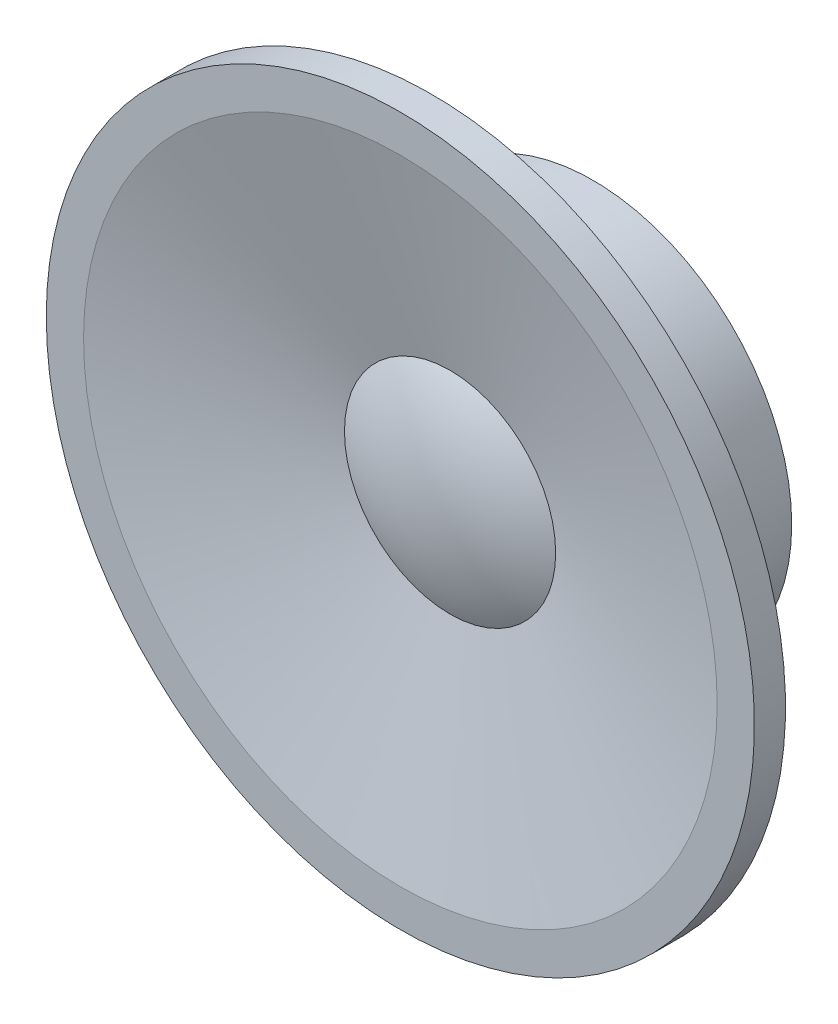
ISO-10303-21;
HEADER;
FILE_DESCRIPTION(('STEP AP214'),'2;1');
FILE_NAME('part.step','',(''),(''),'','','');
FILE_SCHEMA(('AUTOMOTIVE_DESIGN { 1 0 10303 214 1 1 1 1 }'));
ENDSEC;
DATA;
#1=APPLICATION_CONTEXT('core data for automotive mechanical design processes');
#2=APPLICATION_PROTOCOL_DEFINITION('international standard','automotive_design',2000,#1);
#3=PRODUCT_CONTEXT('',#1,'mechanical');
#4=PRODUCT('Part','Part','',(#3));
#5=PRODUCT_RELATED_PRODUCT_CATEGORY('part','',(#4));
#6=PRODUCT_DEFINITION_FORMATION('','',#4);
#7=PRODUCT_DEFINITION_CONTEXT('part definition',#1,'design');
#8=PRODUCT_DEFINITION('design','',#6,#7);
#9=PRODUCT_DEFINITION_SHAPE('','',#8);
#10=(LENGTH_UNIT() NAMED_UNIT(*) SI_UNIT(.MILLI.,.METRE.));
#11=(NAMED_UNIT(*) PLANE_ANGLE_UNIT() SI_UNIT($,.RADIAN.));
#12=(NAMED_UNIT(*) SI_UNIT($,.STERADIAN.) SOLID_ANGLE_UNIT());
#13=UNCERTAINTY_MEASURE_WITH_UNIT(LENGTH_MEASURE(1.E-05),#10,'distance_accuracy_value','');
#14=(GEOMETRIC_REPRESENTATION_CONTEXT(3) GLOBAL_UNCERTAINTY_ASSIGNED_CONTEXT((#13)) GLOBAL_UNIT_ASSIGNED_CONTEXT((#10,
#11,#12)) REPRESENTATION_CONTEXT('',''));
#15=CARTESIAN_POINT('',(0.,0.,0.));
#16=DIRECTION('',(0.,0.,1.));
#17=DIRECTION('',(1.,0.,0.));
#18=AXIS2_PLACEMENT_3D('',#15,#16,#17);
#19=CARTESIAN_POINT('',(0.,0.,-4.));
#20=DIRECTION('',(0.,0.,1.));
#21=DIRECTION('',(1.,0.,0.));
#22=AXIS2_PLACEMENT_3D('',#19,#20,#21);
#23=CONICAL_SURFACE('',#22,8.5,1.339705659599);
#24=CARTESIAN_POINT('',(0.,0.,0.));
#25=DIRECTION('',(0.,0.,-1.));
#26=DIRECTION('',(-1.,0.,0.));
#27=AXIS2_PLACEMENT_3D('',#24,#25,#26);
#28=CIRCLE('',#27,25.5);
#29=CARTESIAN_POINT('',(25.5,0.,0.));
#30=VERTEX_POINT('',#29);
#31=EDGE_CURVE('E10',#30,#30,#28,.T.);
#32=CARTESIAN_POINT('',(0.,0.,-4.));
#33=DIRECTION('',(0.,0.,-1.));
#34=DIRECTION('',(-1.,0.,0.));
#35=AXIS2_PLACEMENT_3D('',#32,#33,#34);
#36=CIRCLE('',#35,8.5);
#37=CARTESIAN_POINT('',(8.5,0.,-4.));
#38=VERTEX_POINT('',#37);
#39=EDGE_CURVE('E64',#38,#38,#36,.T.);
#40=CARTESIAN_POINT('',(25.5,0.,0.));
#41=CARTESIAN_POINT('',(25.3229166666667,0.,-0.0416666666666663));
#42=CARTESIAN_POINT('',(25.1458333333333,0.,-0.0833333333333331));
#43=CARTESIAN_POINT('',(24.7916666666667,0.,-0.166666666666667));
#44=CARTESIAN_POINT('',(24.6145833333333,0.,-0.208333333333333));
#45=CARTESIAN_POINT('',(24.2604166666667,0.,-0.291666666666666));
#46=CARTESIAN_POINT('',(24.0833333333333,0.,-0.333333333333332));
#47=CARTESIAN_POINT('',(23.7291666666667,0.,-0.416666666666666));
#48=CARTESIAN_POINT('',(23.5520833333333,0.,-0.458333333333333));
#49=CARTESIAN_POINT('',(23.1979166666667,0.,-0.541666666666667));
#50=CARTESIAN_POINT('',(23.0208333333333,0.,-0.583333333333333));
#51=CARTESIAN_POINT('',(22.6666666666667,0.,-0.666666666666666));
#52=CARTESIAN_POINT('',(22.4895833333333,0.,-0.708333333333333));
#53=CARTESIAN_POINT('',(22.1354166666667,0.,-0.791666666666666));
#54=CARTESIAN_POINT('',(21.9583333333333,0.,-0.833333333333333));
#55=CARTESIAN_POINT('',(21.6041666666667,0.,-0.916666666666666));
#56=CARTESIAN_POINT('',(21.4270833333333,0.,-0.958333333333333));
#57=CARTESIAN_POINT('',(21.0729166666667,0.,-1.04166666666667));
#58=CARTESIAN_POINT('',(20.8958333333333,0.,-1.08333333333333));
#59=CARTESIAN_POINT('',(20.5416666666667,0.,-1.16666666666667));
#60=CARTESIAN_POINT('',(20.3645833333333,0.,-1.20833333333333));
#61=CARTESIAN_POINT('',(20.0104166666667,0.,-1.29166666666667));
#62=CARTESIAN_POINT('',(19.8333333333333,0.,-1.33333333333333));
#63=CARTESIAN_POINT('',(19.4791666666667,0.,-1.41666666666667));
#64=CARTESIAN_POINT('',(19.3020833333333,0.,-1.45833333333333));
#65=CARTESIAN_POINT('',(18.9479166666667,0.,-1.54166666666667));
#66=CARTESIAN_POINT('',(18.7708333333333,0.,-1.58333333333333));
#67=CARTESIAN_POINT('',(18.4166666666667,0.,-1.66666666666667));
#68=CARTESIAN_POINT('',(18.2395833333333,0.,-1.70833333333333));
#69=CARTESIAN_POINT('',(17.8854166666667,0.,-1.79166666666667));
#70=CARTESIAN_POINT('',(17.7083333333333,0.,-1.83333333333333));
#71=CARTESIAN_POINT('',(17.3541666666667,0.,-1.91666666666667));
#72=CARTESIAN_POINT('',(17.1770833333333,0.,-1.95833333333333));
#73=CARTESIAN_POINT('',(16.8229166666667,0.,-2.04166666666667));
#74=CARTESIAN_POINT('',(16.6458333333333,0.,-2.08333333333333));
#75=CARTESIAN_POINT('',(16.2916666666667,0.,-2.16666666666667));
#76=CARTESIAN_POINT('',(16.1145833333333,0.,-2.20833333333333));
#77=CARTESIAN_POINT('',(15.7604166666667,0.,-2.29166666666667));
#78=CARTESIAN_POINT('',(15.5833333333333,0.,-2.33333333333333));
#79=CARTESIAN_POINT('',(15.2291666666667,0.,-2.41666666666667));
#80=CARTESIAN_POINT('',(15.0520833333333,0.,-2.45833333333333));
#81=CARTESIAN_POINT('',(14.6979166666667,0.,-2.54166666666667));
#82=CARTESIAN_POINT('',(14.5208333333333,0.,-2.58333333333333));
#83=CARTESIAN_POINT('',(14.1666666666667,0.,-2.66666666666667));
#84=CARTESIAN_POINT('',(13.9895833333333,0.,-2.70833333333333));
#85=CARTESIAN_POINT('',(13.6354166666667,0.,-2.79166666666667));
#86=CARTESIAN_POINT('',(13.4583333333333,0.,-2.83333333333333));
#87=CARTESIAN_POINT('',(13.1041666666667,0.,-2.91666666666667));
#88=CARTESIAN_POINT('',(12.9270833333333,0.,-2.95833333333333));
#89=CARTESIAN_POINT('',(12.5729166666667,0.,-3.04166666666667));
#90=CARTESIAN_POINT('',(12.3958333333333,0.,-3.08333333333333));
#91=CARTESIAN_POINT('',(12.0416666666667,0.,-3.16666666666667));
#92=CARTESIAN_POINT('',(11.8645833333333,0.,-3.20833333333333));
#93=CARTESIAN_POINT('',(11.5104166666667,0.,-3.29166666666667));
#94=CARTESIAN_POINT('',(11.3333333333333,0.,-3.33333333333333));
#95=CARTESIAN_POINT('',(10.9791666666667,0.,-3.41666666666667));
#96=CARTESIAN_POINT('',(10.8020833333333,0.,-3.45833333333333));
#97=CARTESIAN_POINT('',(10.4479166666667,0.,-3.54166666666667));
#98=CARTESIAN_POINT('',(10.2708333333333,0.,-3.58333333333333));
#99=CARTESIAN_POINT('',(9.91666666666667,0.,-3.66666666666667));
#100=CARTESIAN_POINT('',(9.73958333333333,0.,-3.70833333333333));
#101=CARTESIAN_POINT('',(9.38541666666667,0.,-3.79166666666667));
#102=CARTESIAN_POINT('',(9.20833333333333,0.,-3.83333333333333));
#103=CARTESIAN_POINT('',(8.85416666666667,0.,-3.91666666666667));
#104=CARTESIAN_POINT('',(8.67708333333333,0.,-3.95833333333333));
#105=CARTESIAN_POINT('',(8.5,0.,-4.));
#106=B_SPLINE_CURVE_WITH_KNOTS('',3,(#40,#41,#42,#43,#44,#45,#46,#47,#48,#49,#50,#51,#52,#53,
#54,#55,#56,#57,#58,#59,#60,#61,#62,#63,#64,#65,#66,#67,#68,#69,#70,#71,#72,#73,#74,#75,#76,#77,
#78,#79,#80,#81,#82,#83,#84,#85,#86,#87,#88,#89,#90,#91,#92,#93,#94,#95,#96,#97,#98,#99,#100,
#101,#102,#103,#104,#105),.UNSPECIFIED.,.F.,.F.,(4,2,2,2,2,2,2,2,2,2,2,2,2,2,2,2,2,2,2,2,2,2,2,
2,2,2,2,2,2,2,2,2,4),(0.,0.54575778739291,1.09151557478581,1.63727336217872,2.18303114957162,
2.72878893696453,3.27454672435744,3.82030451175034,4.36606229914325,4.91182008653615,
5.45757787392906,6.00333566132196,6.54909344871487,7.09485123610777,7.64060902350068,
8.18636681089358,8.73212459828649,9.27788238567939,9.8236401730723,10.3693979604652,
10.9151557478581,11.460913535251,12.0066713226439,12.5524291100368,13.0981868974297,
13.6439446848226,14.1897024722155,14.7354602596084,15.2812180470014,15.8269758343943,
16.3727336217872,16.9184914091801,17.464249196573),.UNSPECIFIED.);
#107=EDGE_CURVE('BSEAM33',#30,#38,#106,.T.);
#108=ORIENTED_EDGE('',*,*,#31,.F.);
#109=ORIENTED_EDGE('',*,*,#39,.T.);
#110=ORIENTED_EDGE('',*,*,#107,.T.);
#111=ORIENTED_EDGE('',*,*,#107,.F.);
#112=EDGE_LOOP('',(#108,#110,#109,#111));
#113=FACE_BOUND('',#112,.T.);
#114=ADVANCED_FACE('F33',(#113),#23,.F.);
#115=CARTESIAN_POINT('',(25.5,0.,0.));
#116=DIRECTION('',(0.,0.,-1.));
#117=DIRECTION('',(-1.,0.,0.));
#118=AXIS2_PLACEMENT_3D('',#115,#116,#117);
#119=PLANE('',#118);
#120=CARTESIAN_POINT('',(0.,0.,0.));
#121=DIRECTION('',(0.,0.,-1.));
#122=DIRECTION('',(-1.,0.,0.));
#123=AXIS2_PLACEMENT_3D('',#120,#121,#122);
#124=CIRCLE('',#123,28.5);
#125=CARTESIAN_POINT('',(-28.5,0.,0.));
#126=VERTEX_POINT('',#125);
#127=EDGE_CURVE('E39',#126,#126,#124,.T.);
#128=ORIENTED_EDGE('',*,*,#127,.F.);
#129=EDGE_LOOP('',(#128));
#130=FACE_BOUND('',#129,.T.);
#131=ORIENTED_EDGE('',*,*,#31,.T.);
#132=EDGE_LOOP('',(#131));
#133=FACE_BOUND('',#132,.T.);
#134=ADVANCED_FACE('F80',(#130,#133),#119,.F.);
#135=CARTESIAN_POINT('',(0.,0.,-16.5));
#136=DIRECTION('',(0.,0.,-1.));
#137=DIRECTION('',(-1.,0.,0.));
#138=AXIS2_PLACEMENT_3D('',#135,#136,#137);
#139=CYLINDRICAL_SURFACE('',#138,28.5);
#140=CARTESIAN_POINT('',(0.,0.,-2.5));
#141=DIRECTION('',(0.,0.,-1.));
#142=DIRECTION('',(-1.,0.,0.));
#143=AXIS2_PLACEMENT_3D('',#140,#141,#142);
#144=CIRCLE('',#143,28.5);
#145=CARTESIAN_POINT('',(-28.5,0.,-2.49999999999999));
#146=VERTEX_POINT('',#145);
#147=EDGE_CURVE('E43',#146,#146,#144,.T.);
#148=ORIENTED_EDGE('',*,*,#147,.F.);
#149=EDGE_LOOP('',(#148));
#150=FACE_BOUND('',#149,.T.);
#151=ORIENTED_EDGE('',*,*,#127,.T.);
#152=EDGE_LOOP('',(#151));
#153=FACE_BOUND('',#152,.T.);
#154=ADVANCED_FACE('F85',(#150,#153),#139,.T.);
#155=CARTESIAN_POINT('',(28.5,0.,-2.5));
#156=DIRECTION('',(0.,0.,1.));
#157=DIRECTION('',(1.,0.,0.));
#158=AXIS2_PLACEMENT_3D('',#155,#156,#157);
#159=PLANE('',#158);
#160=CARTESIAN_POINT('',(0.,0.,-2.5));
#161=DIRECTION('',(0.,0.,-1.));
#162=DIRECTION('',(-1.,0.,0.));
#163=AXIS2_PLACEMENT_3D('',#160,#161,#162);
#164=CIRCLE('',#163,26.5);
#165=CARTESIAN_POINT('',(-26.5,0.,-2.49999999999999));
#166=VERTEX_POINT('',#165);
#167=EDGE_CURVE('E47',#166,#166,#164,.T.);
#168=ORIENTED_EDGE('',*,*,#167,.F.);
#169=EDGE_LOOP('',(#168));
#170=FACE_BOUND('',#169,.T.);
#171=ORIENTED_EDGE('',*,*,#147,.T.);
#172=EDGE_LOOP('',(#171));
#173=FACE_BOUND('',#172,.T.);
#174=ADVANCED_FACE('F90',(#170,#173),#159,.F.);
#175=CARTESIAN_POINT('',(0.,0.,-2.5));
#176=DIRECTION('',(0.,0.,1.));
#177=DIRECTION('',(1.,0.,0.));
#178=AXIS2_PLACEMENT_3D('',#175,#176,#177);
#179=CONICAL_SURFACE('',#178,26.5,1.1263771168938);
#180=CARTESIAN_POINT('',(0.,0.,-7.5));
#181=DIRECTION('',(0.,0.,-1.));
#182=DIRECTION('',(-1.,0.,0.));
#183=AXIS2_PLACEMENT_3D('',#180,#181,#182);
#184=CIRCLE('',#183,16.);
#185=CARTESIAN_POINT('',(-16.,0.,-7.5));
#186=VERTEX_POINT('',#185);
#187=EDGE_CURVE('E52',#186,#186,#184,.T.);
#188=ORIENTED_EDGE('',*,*,#187,.F.);
#189=EDGE_LOOP('',(#188));
#190=FACE_BOUND('',#189,.T.);
#191=ORIENTED_EDGE('',*,*,#167,.T.);
#192=EDGE_LOOP('',(#191));
#193=FACE_BOUND('',#192,.T.);
#194=ADVANCED_FACE('F96',(#190,#193),#179,.T.);
#195=CARTESIAN_POINT('',(0.,0.,-16.5));
#196=DIRECTION('',(0.,0.,-1.));
#197=DIRECTION('',(-1.,0.,0.));
#198=AXIS2_PLACEMENT_3D('',#195,#196,#197);
#199=CYLINDRICAL_SURFACE('',#198,16.);
#200=CARTESIAN_POINT('',(0.,0.,-15.5));
#201=DIRECTION('',(0.,0.,-1.));
#202=DIRECTION('',(-1.,0.,0.));
#203=AXIS2_PLACEMENT_3D('',#200,#201,#202);
#204=CIRCLE('',#203,16.);
#205=CARTESIAN_POINT('',(-16.,0.,-15.5));
#206=VERTEX_POINT('',#205);
#207=EDGE_CURVE('E55',#206,#206,#204,.T.);
#208=ORIENTED_EDGE('',*,*,#207,.F.);
#209=EDGE_LOOP('',(#208));
#210=FACE_BOUND('',#209,.T.);
#211=ORIENTED_EDGE('',*,*,#187,.T.);
#212=EDGE_LOOP('',(#211));
#213=FACE_BOUND('',#212,.T.);
#214=ADVANCED_FACE('F100',(#210,#213),#199,.T.);
#215=CARTESIAN_POINT('',(16.,0.,-15.5));
#216=DIRECTION('',(0.,0.,1.));
#217=DIRECTION('',(1.,0.,0.));
#218=AXIS2_PLACEMENT_3D('',#215,#216,#217);
#219=PLANE('',#218);
#220=CARTESIAN_POINT('',(0.,0.,-15.5));
#221=DIRECTION('',(0.,0.,-1.));
#222=DIRECTION('',(-1.,0.,0.));
#223=AXIS2_PLACEMENT_3D('',#220,#221,#222);
#224=CIRCLE('',#223,14.);
#225=CARTESIAN_POINT('',(-14.,0.,-15.5));
#226=VERTEX_POINT('',#225);
#227=EDGE_CURVE('E58',#226,#226,#224,.T.);
#228=ORIENTED_EDGE('',*,*,#227,.F.);
#229=EDGE_LOOP('',(#228));
#230=FACE_BOUND('',#229,.T.);
#231=ORIENTED_EDGE('',*,*,#207,.T.);
#232=EDGE_LOOP('',(#231));
#233=FACE_BOUND('',#232,.T.);
#234=ADVANCED_FACE('F104',(#230,#233),#219,.F.);
#235=CARTESIAN_POINT('',(0.,0.,-16.5));
#236=DIRECTION('',(0.,0.,-1.));
#237=DIRECTION('',(-1.,0.,0.));
#238=AXIS2_PLACEMENT_3D('',#235,#236,#237);
#239=CYLINDRICAL_SURFACE('',#238,14.);
#240=CARTESIAN_POINT('',(0.,0.,-16.5));
#241=DIRECTION('',(0.,0.,-1.));
#242=DIRECTION('',(-1.,0.,0.));
#243=AXIS2_PLACEMENT_3D('',#240,#241,#242);
#244=CIRCLE('',#243,14.);
#245=CARTESIAN_POINT('',(-14.,0.,-16.5));
#246=VERTEX_POINT('',#245);
#247=EDGE_CURVE('E61',#246,#246,#244,.T.);
#248=ORIENTED_EDGE('',*,*,#247,.F.);
#249=EDGE_LOOP('',(#248));
#250=FACE_BOUND('',#249,.T.);
#251=ORIENTED_EDGE('',*,*,#227,.T.);
#252=EDGE_LOOP('',(#251));
#253=FACE_BOUND('',#252,.T.);
#254=ADVANCED_FACE('F76',(#250,#253),#239,.T.);
#255=CARTESIAN_POINT('',(14.,0.,-16.5));
#256=DIRECTION('',(0.,0.,1.));
#257=DIRECTION('',(1.,0.,0.));
#258=AXIS2_PLACEMENT_3D('',#255,#256,#257);
#259=PLANE('',#258);
#260=ORIENTED_EDGE('',*,*,#247,.T.);
#261=EDGE_LOOP('',(#260));
#262=FACE_BOUND('',#261,.T.);
#263=ADVANCED_FACE('F71',(#262),#259,.F.);
#264=CARTESIAN_POINT('',(0.,0.,-21.0625));
#265=DIRECTION('',(0.,0.,-1.));
#266=DIRECTION('',(-1.,0.,0.));
#267=AXIS2_PLACEMENT_3D('',#264,#265,#266);
#268=SPHERICAL_SURFACE('',#267,19.0625);
#269=ORIENTED_EDGE('',*,*,#39,.F.);
#270=EDGE_LOOP('',(#269));
#271=FACE_BOUND('',#270,.T.);
#272=ADVANCED_FACE('F69',(#271),#268,.T.);
#273=CLOSED_SHELL('',(#114,#134,#154,#174,#194,#214,#234,#254,#263,#272));
#274=MANIFOLD_SOLID_BREP('B2',#273);
#275=ADVANCED_BREP_SHAPE_REPRESENTATION('',(#18,#274),#14);
#276=SHAPE_DEFINITION_REPRESENTATION(#9,#275);
ENDSEC;
END-ISO-10303-21;
